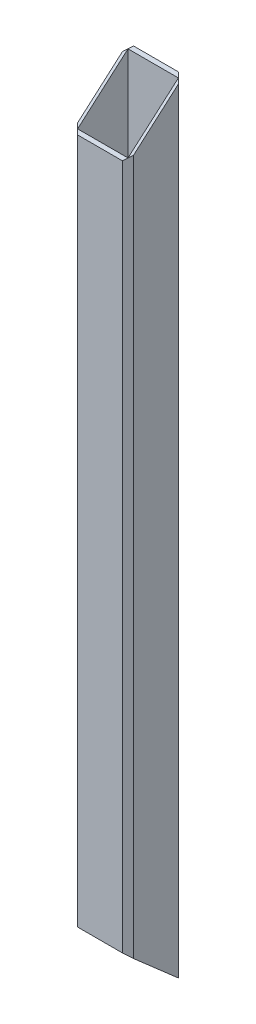
ISO-10303-21;
HEADER;
FILE_DESCRIPTION(('STEP AP214'),'2;1');
FILE_NAME('part.step','',(''),(''),'','','');
FILE_SCHEMA(('AUTOMOTIVE_DESIGN { 1 0 10303 214 1 1 1 1 }'));
ENDSEC;
DATA;
#1=APPLICATION_CONTEXT('core data for automotive mechanical design processes');
#2=APPLICATION_PROTOCOL_DEFINITION('international standard','automotive_design',2000,#1);
#3=PRODUCT_CONTEXT('',#1,'mechanical');
#4=PRODUCT('Part','Part','',(#3));
#5=PRODUCT_RELATED_PRODUCT_CATEGORY('part','',(#4));
#6=PRODUCT_DEFINITION_FORMATION('','',#4);
#7=PRODUCT_DEFINITION_CONTEXT('part definition',#1,'design');
#8=PRODUCT_DEFINITION('design','',#6,#7);
#9=PRODUCT_DEFINITION_SHAPE('','',#8);
#10=(LENGTH_UNIT() NAMED_UNIT(*) SI_UNIT(.MILLI.,.METRE.));
#11=(NAMED_UNIT(*) PLANE_ANGLE_UNIT() SI_UNIT($,.RADIAN.));
#12=(NAMED_UNIT(*) SI_UNIT($,.STERADIAN.) SOLID_ANGLE_UNIT());
#13=UNCERTAINTY_MEASURE_WITH_UNIT(LENGTH_MEASURE(1.E-05),#10,'distance_accuracy_value','');
#14=(GEOMETRIC_REPRESENTATION_CONTEXT(3) GLOBAL_UNCERTAINTY_ASSIGNED_CONTEXT((#13)) GLOBAL_UNIT_ASSIGNED_CONTEXT((#10,
#11,#12)) REPRESENTATION_CONTEXT('',''));
#15=CARTESIAN_POINT('',(0.,0.,0.));
#16=DIRECTION('',(0.,0.,1.));
#17=DIRECTION('',(1.,0.,0.));
#18=AXIS2_PLACEMENT_3D('',#15,#16,#17);
#19=CARTESIAN_POINT('',(50.,43.75,50.));
#20=DIRECTION('',(0.,0.752576694706878,-0.658504607868518));
#21=DIRECTION('',(0.,0.658504607868518,0.752576694706878));
#22=AXIS2_PLACEMENT_3D('',#19,#20,#21);
#23=PLANE('',#22);
#24=DIRECTION('',(0.,-0.658504607868518,-0.752576694706878));
#25=VECTOR('',#24,1.);
#26=CARTESIAN_POINT('',(0.,43.75,50.));
#27=LINE('',#26,#25);
#28=CARTESIAN_POINT('',(0.,39.375,45.0000000000001));
#29=VERTEX_POINT('',#28);
#30=CARTESIAN_POINT('',(0.,4.375,5.));
#31=VERTEX_POINT('',#30);
#32=EDGE_CURVE('E264',#29,#31,#27,.T.);
#33=ORIENTED_EDGE('',*,*,#32,.T.);
#34=DIRECTION('',(0.601316822402267,-0.526152219601978,-0.601316822402261));
#35=VECTOR('',#34,1.);
#36=CARTESIAN_POINT('',(5.00000000000006,0.,0.));
#37=LINE('',#36,#35);
#38=CARTESIAN_POINT('',(2.5,2.18750000000001,2.5));
#39=VERTEX_POINT('',#38);
#40=EDGE_CURVE('E208',#31,#39,#37,.T.);
#41=ORIENTED_EDGE('',*,*,#40,.T.);
#42=DIRECTION('',(0.,0.658504607868518,0.752576694706878));
#43=VECTOR('',#42,1.);
#44=CARTESIAN_POINT('',(2.5,23.5398230088496,26.9026548672566));
#45=LINE('',#44,#43);
#46=CARTESIAN_POINT('',(2.5,41.5625,47.5));
#47=VERTEX_POINT('',#46);
#48=EDGE_CURVE('E288',#39,#47,#45,.T.);
#49=ORIENTED_EDGE('',*,*,#48,.T.);
#50=DIRECTION('',(0.601316822402267,0.526152219601978,0.601316822402261));
#51=VECTOR('',#50,1.);
#52=CARTESIAN_POINT('',(-12.4576271186441,28.4745762711866,32.5423728813561));
#53=LINE('',#52,#51);
#54=EDGE_CURVE('E200',#47,#29,#53,.F.);
#55=ORIENTED_EDGE('',*,*,#54,.T.);
#56=EDGE_LOOP('',(#33,#41,#49,#55));
#57=FACE_BOUND('',#56,.T.);
#58=ADVANCED_FACE('F44',(#57),#23,.F.);
#59=DIRECTION('',(-1.,0.,0.));
#60=VECTOR('',#59,1.);
#61=CARTESIAN_POINT('',(50.,43.75,50.));
#62=LINE('',#61,#60);
#63=CARTESIAN_POINT('',(44.9999999999999,43.75,50.));
#64=VERTEX_POINT('',#63);
#65=CARTESIAN_POINT('',(5.,43.75,50.));
#66=VERTEX_POINT('',#65);
#67=EDGE_CURVE('E280',#64,#66,#62,.T.);
#68=ORIENTED_EDGE('',*,*,#67,.T.);
#69=DIRECTION('',(0.601316822402267,0.526152219601978,0.601316822402261));
#70=VECTOR('',#69,1.);
#71=CARTESIAN_POINT('',(-12.4576271186441,28.4745762711866,32.5423728813561));
#72=LINE('',#71,#70);
#73=EDGE_CURVE('E154',#66,#47,#72,.F.);
#74=ORIENTED_EDGE('',*,*,#73,.T.);
#75=DIRECTION('',(1.,0.,0.));
#76=VECTOR('',#75,1.);
#77=CARTESIAN_POINT('',(47.5,41.5625,47.5));
#78=LINE('',#77,#76);
#79=CARTESIAN_POINT('',(47.5,41.5625,47.5));
#80=VERTEX_POINT('',#79);
#81=EDGE_CURVE('E151',#47,#80,#78,.T.);
#82=ORIENTED_EDGE('',*,*,#81,.T.);
#83=DIRECTION('',(-0.601316822402259,0.526152219601982,0.601316822402266));
#84=VECTOR('',#83,1.);
#85=CARTESIAN_POINT('',(58.8418079096044,31.6384180790959,36.1581920903954));
#86=LINE('',#85,#84);
#87=EDGE_CURVE('E68',#80,#64,#86,.T.);
#88=ORIENTED_EDGE('',*,*,#87,.T.);
#89=EDGE_LOOP('',(#68,#74,#82,#88));
#90=FACE_BOUND('',#89,.T.);
#91=ADVANCED_FACE('F152',(#90),#23,.F.);
#92=DIRECTION('',(-1.,0.,0.));
#93=VECTOR('',#92,1.);
#94=CARTESIAN_POINT('',(2.5,2.18750000000001,2.5));
#95=LINE('',#94,#93);
#96=CARTESIAN_POINT('',(47.5,2.18750000000001,2.5));
#97=VERTEX_POINT('',#96);
#98=EDGE_CURVE('E175',#97,#39,#95,.T.);
#99=ORIENTED_EDGE('',*,*,#98,.T.);
#100=DIRECTION('',(0.601316822402267,-0.526152219601978,-0.601316822402261));
#101=VECTOR('',#100,1.);
#102=CARTESIAN_POINT('',(5.00000000000006,0.,0.));
#103=LINE('',#102,#101);
#104=CARTESIAN_POINT('',(5.00000000000006,0.,0.));
#105=VERTEX_POINT('',#104);
#106=EDGE_CURVE('E205',#39,#105,#103,.T.);
#107=ORIENTED_EDGE('',*,*,#106,.T.);
#108=DIRECTION('',(1.,0.,0.));
#109=VECTOR('',#108,1.);
#110=CARTESIAN_POINT('',(0.,0.,0.));
#111=LINE('',#110,#109);
#112=CARTESIAN_POINT('',(45.,0.,0.));
#113=VERTEX_POINT('',#112);
#114=EDGE_CURVE('E162',#105,#113,#111,.T.);
#115=ORIENTED_EDGE('',*,*,#114,.T.);
#116=DIRECTION('',(-0.601316822402259,-0.526152219601982,-0.601316822402266));
#117=VECTOR('',#116,1.);
#118=CARTESIAN_POINT('',(48.6158192090395,3.16384180790964,3.61581920903958));
#119=LINE('',#118,#117);
#120=EDGE_CURVE('E197',#113,#97,#119,.F.);
#121=ORIENTED_EDGE('',*,*,#120,.T.);
#122=EDGE_LOOP('',(#99,#107,#115,#121));
#123=FACE_BOUND('',#122,.T.);
#124=ADVANCED_FACE('F329',(#123),#23,.F.);
#125=CARTESIAN_POINT('',(50.,656.25,50.));
#126=DIRECTION('',(0.,0.752576694706878,0.658504607868518));
#127=DIRECTION('',(0.,-0.658504607868518,0.752576694706878));
#128=AXIS2_PLACEMENT_3D('',#125,#126,#127);
#129=PLANE('',#128);
#130=DIRECTION('',(1.,0.,0.));
#131=VECTOR('',#130,1.);
#132=CARTESIAN_POINT('',(0.,700.,0.));
#133=LINE('',#132,#131);
#134=CARTESIAN_POINT('',(5.00000000000006,700.,0.));
#135=VERTEX_POINT('',#134);
#136=CARTESIAN_POINT('',(45.,700.,0.));
#137=VERTEX_POINT('',#136);
#138=EDGE_CURVE('E310',#135,#137,#133,.T.);
#139=ORIENTED_EDGE('',*,*,#138,.F.);
#140=DIRECTION('',(-0.601316822402267,-0.526152219601977,0.601316822402261));
#141=VECTOR('',#140,1.);
#142=CARTESIAN_POINT('',(-10.6497175141241,686.306497175141,15.649717514124));
#143=LINE('',#142,#141);
#144=CARTESIAN_POINT('',(2.5,697.8125,2.5));
#145=VERTEX_POINT('',#144);
#146=EDGE_CURVE('E251',#135,#145,#143,.T.);
#147=ORIENTED_EDGE('',*,*,#146,.T.);
#148=DIRECTION('',(-1.,0.,0.));
#149=VECTOR('',#148,1.);
#150=CARTESIAN_POINT('',(2.5,697.8125,2.5));
#151=LINE('',#150,#149);
#152=CARTESIAN_POINT('',(47.5,697.8125,2.5));
#153=VERTEX_POINT('',#152);
#154=EDGE_CURVE('E294',#153,#145,#151,.T.);
#155=ORIENTED_EDGE('',*,*,#154,.F.);
#156=DIRECTION('',(0.601316822402259,-0.526152219601982,0.601316822402266));
#157=VECTOR('',#156,1.);
#158=CARTESIAN_POINT('',(78.7288135593219,670.487288135593,33.7288135593223));
#159=LINE('',#158,#157);
#160=EDGE_CURVE('E230',#153,#137,#159,.F.);
#161=ORIENTED_EDGE('',*,*,#160,.T.);
#162=EDGE_LOOP('',(#139,#147,#155,#161));
#163=FACE_BOUND('',#162,.T.);
#164=ADVANCED_FACE('F335',(#163),#129,.T.);
#165=DIRECTION('',(0.,-0.658504607868518,0.752576694706878));
#166=VECTOR('',#165,1.);
#167=CARTESIAN_POINT('',(2.5,372.920353982301,373.805309734513));
#168=LINE('',#167,#166);
#169=CARTESIAN_POINT('',(2.5,658.4375,47.5));
#170=VERTEX_POINT('',#169);
#171=EDGE_CURVE('E298',#145,#170,#168,.T.);
#172=ORIENTED_EDGE('',*,*,#171,.F.);
#173=DIRECTION('',(-0.601316822402267,-0.526152219601977,0.601316822402261));
#174=VECTOR('',#173,1.);
#175=CARTESIAN_POINT('',(-10.6497175141241,686.306497175141,15.649717514124));
#176=LINE('',#175,#174);
#177=CARTESIAN_POINT('',(0.,695.625,5.00000000000001));
#178=VERTEX_POINT('',#177);
#179=EDGE_CURVE('E248',#145,#178,#176,.T.);
#180=ORIENTED_EDGE('',*,*,#179,.T.);
#181=DIRECTION('',(0.,0.658504607868518,-0.752576694706878));
#182=VECTOR('',#181,1.);
#183=CARTESIAN_POINT('',(0.,656.25,50.));
#184=LINE('',#183,#182);
#185=CARTESIAN_POINT('',(0.,660.625,45.0000000000001));
#186=VERTEX_POINT('',#185);
#187=EDGE_CURVE('E261',#186,#178,#184,.T.);
#188=ORIENTED_EDGE('',*,*,#187,.F.);
#189=DIRECTION('',(-0.601316822402268,0.526152219601978,-0.601316822402261));
#190=VECTOR('',#189,1.);
#191=CARTESIAN_POINT('',(21.2711864406782,642.012711864407,66.271186440678));
#192=LINE('',#191,#190);
#193=EDGE_CURVE('E245',#186,#170,#192,.F.);
#194=ORIENTED_EDGE('',*,*,#193,.T.);
#195=EDGE_LOOP('',(#172,#180,#188,#194));
#196=FACE_BOUND('',#195,.T.);
#197=ADVANCED_FACE('F269',(#196),#129,.T.);
#198=DIRECTION('',(0.,0.658504607868518,-0.752576694706878));
#199=VECTOR('',#198,1.);
#200=CARTESIAN_POINT('',(50.,656.25,50.));
#201=LINE('',#200,#199);
#202=CARTESIAN_POINT('',(50.,660.625,44.9999999999999));
#203=VERTEX_POINT('',#202);
#204=CARTESIAN_POINT('',(50.,695.625,5.00000000000004));
#205=VERTEX_POINT('',#204);
#206=EDGE_CURVE('E220',#203,#205,#201,.T.);
#207=ORIENTED_EDGE('',*,*,#206,.T.);
#208=DIRECTION('',(0.601316822402259,-0.526152219601982,0.601316822402266));
#209=VECTOR('',#208,1.);
#210=CARTESIAN_POINT('',(78.7288135593219,670.487288135593,33.7288135593223));
#211=LINE('',#210,#209);
#212=EDGE_CURVE('E239',#205,#153,#211,.F.);
#213=ORIENTED_EDGE('',*,*,#212,.T.);
#214=DIRECTION('',(0.,0.658504607868518,-0.752576694706878));
#215=VECTOR('',#214,1.);
#216=CARTESIAN_POINT('',(47.5000000000001,395.221238938054,348.318584070796));
#217=LINE('',#216,#215);
#218=CARTESIAN_POINT('',(47.5,658.4375,47.5));
#219=VERTEX_POINT('',#218);
#220=EDGE_CURVE('E291',#219,#153,#217,.T.);
#221=ORIENTED_EDGE('',*,*,#220,.F.);
#222=DIRECTION('',(0.601316822402259,0.526152219601982,-0.601316822402266));
#223=VECTOR('',#222,1.);
#224=CARTESIAN_POINT('',(46.8079096045197,657.831920903955,48.1920903954802));
#225=LINE('',#224,#223);
#226=EDGE_CURVE('E221',#219,#203,#225,.T.);
#227=ORIENTED_EDGE('',*,*,#226,.T.);
#228=EDGE_LOOP('',(#207,#213,#221,#227));
#229=FACE_BOUND('',#228,.T.);
#230=ADVANCED_FACE('F332',(#229),#129,.T.);
#231=CARTESIAN_POINT('',(47.5,0.,47.5));
#232=DIRECTION('',(0.,0.,-1.));
#233=DIRECTION('',(-1.,0.,0.));
#234=AXIS2_PLACEMENT_3D('',#231,#232,#233);
#235=PLANE('',#234);
#236=DIRECTION('',(0.,1.,0.));
#237=VECTOR('',#236,1.);
#238=CARTESIAN_POINT('',(2.5,0.,47.5));
#239=LINE('',#238,#237);
#240=EDGE_CURVE('E182',#47,#170,#239,.T.);
#241=ORIENTED_EDGE('',*,*,#240,.T.);
#242=DIRECTION('',(1.,0.,0.));
#243=VECTOR('',#242,1.);
#244=CARTESIAN_POINT('',(47.4999999999999,658.4375,47.5));
#245=LINE('',#244,#243);
#246=EDGE_CURVE('E161',#170,#219,#245,.T.);
#247=ORIENTED_EDGE('',*,*,#246,.T.);
#248=DIRECTION('',(0.,1.,0.));
#249=VECTOR('',#248,1.);
#250=CARTESIAN_POINT('',(47.5,0.,47.5));
#251=LINE('',#250,#249);
#252=EDGE_CURVE('E169',#80,#219,#251,.T.);
#253=ORIENTED_EDGE('',*,*,#252,.F.);
#254=ORIENTED_EDGE('',*,*,#81,.F.);
#255=EDGE_LOOP('',(#241,#247,#253,#254));
#256=FACE_BOUND('',#255,.T.);
#257=ADVANCED_FACE('F179',(#256),#235,.T.);
#258=CARTESIAN_POINT('',(47.5,0.,2.5));
#259=DIRECTION('',(-1.,0.,0.));
#260=DIRECTION('',(0.,0.,1.));
#261=AXIS2_PLACEMENT_3D('',#258,#259,#260);
#262=PLANE('',#261);
#263=ORIENTED_EDGE('',*,*,#252,.T.);
#264=ORIENTED_EDGE('',*,*,#220,.T.);
#265=DIRECTION('',(0.,1.,0.));
#266=VECTOR('',#265,1.);
#267=CARTESIAN_POINT('',(47.5,0.,2.5));
#268=LINE('',#267,#266);
#269=EDGE_CURVE('E172',#97,#153,#268,.T.);
#270=ORIENTED_EDGE('',*,*,#269,.F.);
#271=DIRECTION('',(0.,-0.658504607868518,-0.752576694706878));
#272=VECTOR('',#271,1.);
#273=CARTESIAN_POINT('',(47.5,1.23893805309735,1.41592920353982));
#274=LINE('',#273,#272);
#275=EDGE_CURVE('E141',#80,#97,#274,.T.);
#276=ORIENTED_EDGE('',*,*,#275,.F.);
#277=EDGE_LOOP('',(#263,#264,#270,#276));
#278=FACE_BOUND('',#277,.T.);
#279=ADVANCED_FACE('F167',(#278),#262,.T.);
#280=CARTESIAN_POINT('',(2.5,0.,2.5));
#281=DIRECTION('',(0.,0.,1.));
#282=DIRECTION('',(1.,0.,0.));
#283=AXIS2_PLACEMENT_3D('',#280,#281,#282);
#284=PLANE('',#283);
#285=ORIENTED_EDGE('',*,*,#269,.T.);
#286=ORIENTED_EDGE('',*,*,#154,.T.);
#287=DIRECTION('',(0.,1.,0.));
#288=VECTOR('',#287,1.);
#289=CARTESIAN_POINT('',(2.5,0.,2.5));
#290=LINE('',#289,#288);
#291=EDGE_CURVE('E306',#39,#145,#290,.T.);
#292=ORIENTED_EDGE('',*,*,#291,.F.);
#293=ORIENTED_EDGE('',*,*,#98,.F.);
#294=EDGE_LOOP('',(#285,#286,#292,#293));
#295=FACE_BOUND('',#294,.T.);
#296=ADVANCED_FACE('F338',(#295),#284,.T.);
#297=CARTESIAN_POINT('',(2.5,0.,47.5));
#298=DIRECTION('',(1.,0.,0.));
#299=DIRECTION('',(0.,0.,-1.));
#300=AXIS2_PLACEMENT_3D('',#297,#298,#299);
#301=PLANE('',#300);
#302=ORIENTED_EDGE('',*,*,#291,.T.);
#303=ORIENTED_EDGE('',*,*,#171,.T.);
#304=ORIENTED_EDGE('',*,*,#240,.F.);
#305=ORIENTED_EDGE('',*,*,#48,.F.);
#306=EDGE_LOOP('',(#302,#303,#304,#305));
#307=FACE_BOUND('',#306,.T.);
#308=ADVANCED_FACE('F341',(#307),#301,.T.);
#309=ORIENTED_EDGE('',*,*,#275,.T.);
#310=DIRECTION('',(-0.601316822402259,-0.526152219601982,-0.601316822402266));
#311=VECTOR('',#310,1.);
#312=CARTESIAN_POINT('',(48.6158192090395,3.16384180790964,3.61581920903958));
#313=LINE('',#312,#311);
#314=CARTESIAN_POINT('',(50.,4.37500000000005,5.00000000000006));
#315=VERTEX_POINT('',#314);
#316=EDGE_CURVE('E148',#97,#315,#313,.F.);
#317=ORIENTED_EDGE('',*,*,#316,.T.);
#318=DIRECTION('',(0.,-0.658504607868518,-0.752576694706878));
#319=VECTOR('',#318,1.);
#320=CARTESIAN_POINT('',(50.,43.75,50.));
#321=LINE('',#320,#319);
#322=CARTESIAN_POINT('',(50.,39.3749999999999,44.9999999999999));
#323=VERTEX_POINT('',#322);
#324=EDGE_CURVE('E144',#323,#315,#321,.T.);
#325=ORIENTED_EDGE('',*,*,#324,.F.);
#326=DIRECTION('',(-0.601316822402259,0.526152219601982,0.601316822402266));
#327=VECTOR('',#326,1.);
#328=CARTESIAN_POINT('',(58.8418079096044,31.6384180790959,36.1581920903954));
#329=LINE('',#328,#327);
#330=EDGE_CURVE('E138',#323,#80,#329,.T.);
#331=ORIENTED_EDGE('',*,*,#330,.T.);
#332=EDGE_LOOP('',(#309,#317,#325,#331));
#333=FACE_BOUND('',#332,.T.);
#334=ADVANCED_FACE('F139',(#333),#23,.F.);
#335=ORIENTED_EDGE('',*,*,#246,.F.);
#336=DIRECTION('',(-0.601316822402268,0.526152219601978,-0.601316822402261));
#337=VECTOR('',#336,1.);
#338=CARTESIAN_POINT('',(21.2711864406782,642.012711864407,66.271186440678));
#339=LINE('',#338,#337);
#340=CARTESIAN_POINT('',(5.,656.25,50.));
#341=VERTEX_POINT('',#340);
#342=EDGE_CURVE('E242',#170,#341,#339,.F.);
#343=ORIENTED_EDGE('',*,*,#342,.T.);
#344=DIRECTION('',(-1.,0.,0.));
#345=VECTOR('',#344,1.);
#346=CARTESIAN_POINT('',(50.,656.25,50.));
#347=LINE('',#346,#345);
#348=CARTESIAN_POINT('',(44.9999999999999,656.25,50.));
#349=VERTEX_POINT('',#348);
#350=EDGE_CURVE('E176',#349,#341,#347,.T.);
#351=ORIENTED_EDGE('',*,*,#350,.F.);
#352=DIRECTION('',(0.601316822402259,0.526152219601982,-0.601316822402266));
#353=VECTOR('',#352,1.);
#354=CARTESIAN_POINT('',(46.8079096045197,657.831920903955,48.1920903954802));
#355=LINE('',#354,#353);
#356=EDGE_CURVE('E222',#349,#219,#355,.T.);
#357=ORIENTED_EDGE('',*,*,#356,.T.);
#358=EDGE_LOOP('',(#335,#343,#351,#357));
#359=FACE_BOUND('',#358,.T.);
#360=ADVANCED_FACE('F366',(#359),#129,.T.);
#361=CARTESIAN_POINT('',(0.,0.,50.));
#362=DIRECTION('',(-1.,0.,0.));
#363=DIRECTION('',(0.,0.,1.));
#364=AXIS2_PLACEMENT_3D('',#361,#362,#363);
#365=PLANE('',#364);
#366=ORIENTED_EDGE('',*,*,#187,.T.);
#367=DIRECTION('',(0.,-1.,0.));
#368=VECTOR('',#367,1.);
#369=CARTESIAN_POINT('',(0.,0.,5.));
#370=LINE('',#369,#368);
#371=EDGE_CURVE('E188',#178,#31,#370,.T.);
#372=ORIENTED_EDGE('',*,*,#371,.T.);
#373=ORIENTED_EDGE('',*,*,#32,.F.);
#374=DIRECTION('',(0.,1.,0.));
#375=VECTOR('',#374,1.);
#376=CARTESIAN_POINT('',(0.,0.,45.0000000000001));
#377=LINE('',#376,#375);
#378=EDGE_CURVE('E191',#29,#186,#377,.T.);
#379=ORIENTED_EDGE('',*,*,#378,.T.);
#380=EDGE_LOOP('',(#366,#372,#373,#379));
#381=FACE_BOUND('',#380,.T.);
#382=ADVANCED_FACE('F260',(#381),#365,.T.);
#383=CARTESIAN_POINT('',(50.,0.,50.));
#384=DIRECTION('',(-1.,0.,0.));
#385=DIRECTION('',(0.,0.,1.));
#386=AXIS2_PLACEMENT_3D('',#383,#384,#385);
#387=PLANE('',#386);
#388=ORIENTED_EDGE('',*,*,#324,.T.);
#389=DIRECTION('',(0.,1.,0.));
#390=VECTOR('',#389,1.);
#391=CARTESIAN_POINT('',(50.,0.,5.00000000000006));
#392=LINE('',#391,#390);
#393=EDGE_CURVE('E11',#315,#205,#392,.T.);
#394=ORIENTED_EDGE('',*,*,#393,.T.);
#395=ORIENTED_EDGE('',*,*,#206,.F.);
#396=DIRECTION('',(0.,-1.,0.));
#397=VECTOR('',#396,1.);
#398=CARTESIAN_POINT('',(50.,43.75,44.9999999999999));
#399=LINE('',#398,#397);
#400=EDGE_CURVE('E54',#203,#323,#399,.T.);
#401=ORIENTED_EDGE('',*,*,#400,.T.);
#402=EDGE_LOOP('',(#388,#394,#395,#401));
#403=FACE_BOUND('',#402,.T.);
#404=ADVANCED_FACE('F217',(#403),#387,.F.);
#405=CARTESIAN_POINT('',(0.,0.,50.));
#406=DIRECTION('',(0.,0.,1.));
#407=DIRECTION('',(1.,0.,0.));
#408=AXIS2_PLACEMENT_3D('',#405,#406,#407);
#409=PLANE('',#408);
#410=ORIENTED_EDGE('',*,*,#350,.T.);
#411=DIRECTION('',(0.,-1.,0.));
#412=VECTOR('',#411,1.);
#413=CARTESIAN_POINT('',(5.,0.,50.));
#414=LINE('',#413,#412);
#415=EDGE_CURVE('E61',#341,#66,#414,.T.);
#416=ORIENTED_EDGE('',*,*,#415,.T.);
#417=ORIENTED_EDGE('',*,*,#67,.F.);
#418=DIRECTION('',(0.,1.,0.));
#419=VECTOR('',#418,1.);
#420=CARTESIAN_POINT('',(44.9999999999999,656.25,50.));
#421=LINE('',#420,#419);
#422=EDGE_CURVE('E186',#64,#349,#421,.T.);
#423=ORIENTED_EDGE('',*,*,#422,.T.);
#424=EDGE_LOOP('',(#410,#416,#417,#423));
#425=FACE_BOUND('',#424,.T.);
#426=ADVANCED_FACE('F355',(#425),#409,.T.);
#427=CARTESIAN_POINT('',(0.,0.,0.));
#428=DIRECTION('',(0.,0.,1.));
#429=DIRECTION('',(1.,0.,0.));
#430=AXIS2_PLACEMENT_3D('',#427,#428,#429);
#431=PLANE('',#430);
#432=ORIENTED_EDGE('',*,*,#114,.F.);
#433=DIRECTION('',(0.,1.,0.));
#434=VECTOR('',#433,1.);
#435=CARTESIAN_POINT('',(5.00000000000006,700.,0.));
#436=LINE('',#435,#434);
#437=EDGE_CURVE('E226',#105,#135,#436,.T.);
#438=ORIENTED_EDGE('',*,*,#437,.T.);
#439=ORIENTED_EDGE('',*,*,#138,.T.);
#440=DIRECTION('',(0.,-1.,0.));
#441=VECTOR('',#440,1.);
#442=CARTESIAN_POINT('',(45.,0.,0.));
#443=LINE('',#442,#441);
#444=EDGE_CURVE('E233',#137,#113,#443,.T.);
#445=ORIENTED_EDGE('',*,*,#444,.T.);
#446=EDGE_LOOP('',(#432,#438,#439,#445));
#447=FACE_BOUND('',#446,.T.);
#448=ADVANCED_FACE('F322',(#447),#431,.F.);
#449=CARTESIAN_POINT('',(5.00000000000006,0.,0.));
#450=DIRECTION('',(-0.707106781186543,0.,-0.707106781186551));
#451=DIRECTION('',(0.,-1.,0.));
#452=AXIS2_PLACEMENT_3D('',#449,#450,#451);
#453=PLANE('',#452);
#454=ORIENTED_EDGE('',*,*,#40,.F.);
#455=ORIENTED_EDGE('',*,*,#371,.F.);
#456=ORIENTED_EDGE('',*,*,#179,.F.);
#457=ORIENTED_EDGE('',*,*,#146,.F.);
#458=ORIENTED_EDGE('',*,*,#437,.F.);
#459=ORIENTED_EDGE('',*,*,#106,.F.);
#460=EDGE_LOOP('',(#454,#455,#456,#457,#458,#459));
#461=FACE_BOUND('',#460,.T.);
#462=ADVANCED_FACE('F345',(#461),#453,.T.);
#463=CARTESIAN_POINT('',(0.,0.,45.0000000000001));
#464=DIRECTION('',(0.707106781186544,0.,-0.707106781186551));
#465=DIRECTION('',(0.,1.,0.));
#466=AXIS2_PLACEMENT_3D('',#463,#464,#465);
#467=PLANE('',#466);
#468=ORIENTED_EDGE('',*,*,#73,.F.);
#469=ORIENTED_EDGE('',*,*,#415,.F.);
#470=ORIENTED_EDGE('',*,*,#342,.F.);
#471=ORIENTED_EDGE('',*,*,#193,.F.);
#472=ORIENTED_EDGE('',*,*,#378,.F.);
#473=ORIENTED_EDGE('',*,*,#54,.F.);
#474=EDGE_LOOP('',(#468,#469,#470,#471,#472,#473));
#475=FACE_BOUND('',#474,.T.);
#476=ADVANCED_FACE('F347',(#475),#467,.F.);
#477=CARTESIAN_POINT('',(50.,0.,5.00000000000006));
#478=DIRECTION('',(-0.707106781186551,0.,0.707106781186543));
#479=DIRECTION('',(0.,1.,0.));
#480=AXIS2_PLACEMENT_3D('',#477,#478,#479);
#481=PLANE('',#480);
#482=ORIENTED_EDGE('',*,*,#120,.F.);
#483=ORIENTED_EDGE('',*,*,#444,.F.);
#484=ORIENTED_EDGE('',*,*,#160,.F.);
#485=ORIENTED_EDGE('',*,*,#212,.F.);
#486=ORIENTED_EDGE('',*,*,#393,.F.);
#487=ORIENTED_EDGE('',*,*,#316,.F.);
#488=EDGE_LOOP('',(#482,#483,#484,#485,#486,#487));
#489=FACE_BOUND('',#488,.T.);
#490=ADVANCED_FACE('F331',(#489),#481,.F.);
#491=CARTESIAN_POINT('',(44.9999999999999,0.,50.));
#492=DIRECTION('',(0.707106781186551,0.,0.707106781186544));
#493=DIRECTION('',(0.,-1.,0.));
#494=AXIS2_PLACEMENT_3D('',#491,#492,#493);
#495=PLANE('',#494);
#496=ORIENTED_EDGE('',*,*,#330,.F.);
#497=ORIENTED_EDGE('',*,*,#400,.F.);
#498=ORIENTED_EDGE('',*,*,#226,.F.);
#499=ORIENTED_EDGE('',*,*,#356,.F.);
#500=ORIENTED_EDGE('',*,*,#422,.F.);
#501=ORIENTED_EDGE('',*,*,#87,.F.);
#502=EDGE_LOOP('',(#496,#497,#498,#499,#500,#501));
#503=FACE_BOUND('',#502,.T.);
#504=ADVANCED_FACE('F47',(#503),#495,.T.);
#505=CLOSED_SHELL('',(#58,#91,#124,#164,#197,#230,#257,#279,#296,#308,#334,#360,#382,#404,#426,
#448,#462,#476,#490,#504));
#506=MANIFOLD_SOLID_BREP('B2',#505);
#507=ADVANCED_BREP_SHAPE_REPRESENTATION('',(#18,#506),#14);
#508=SHAPE_DEFINITION_REPRESENTATION(#9,#507);
ENDSEC;
END-ISO-10303-21;
